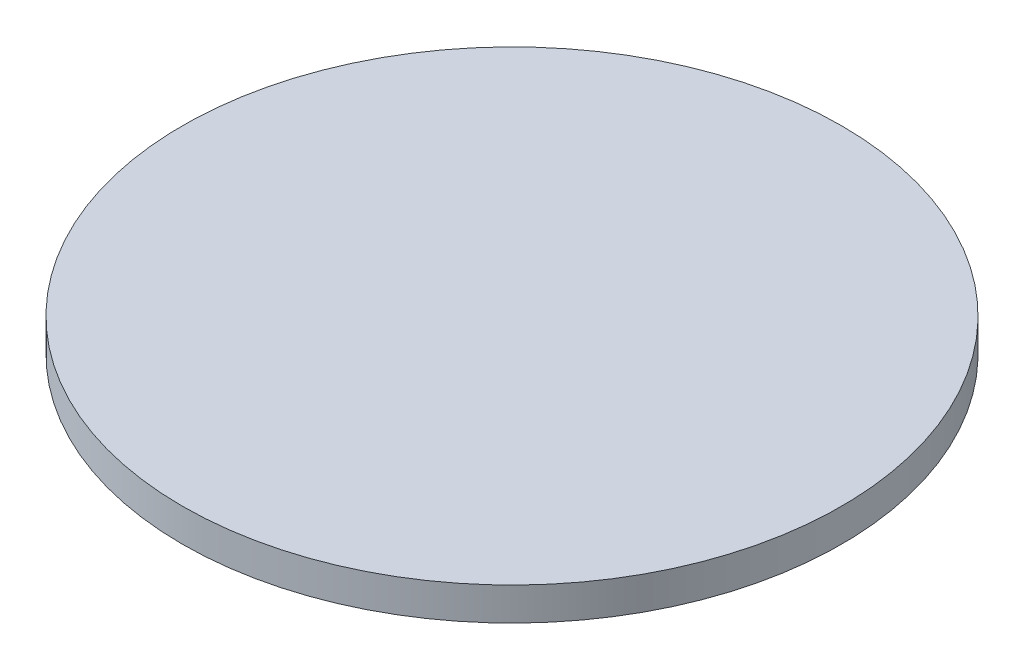
ISO-10303-21;
HEADER;
FILE_DESCRIPTION(('STEP AP214'),'2;1');
FILE_NAME('part.step','',(''),(''),'','','');
FILE_SCHEMA(('AUTOMOTIVE_DESIGN { 1 0 10303 214 1 1 1 1 }'));
ENDSEC;
DATA;
#1=APPLICATION_CONTEXT('core data for automotive mechanical design processes');
#2=APPLICATION_PROTOCOL_DEFINITION('international standard','automotive_design',2000,#1);
#3=PRODUCT_CONTEXT('',#1,'mechanical');
#4=PRODUCT('Part','Part','',(#3));
#5=PRODUCT_RELATED_PRODUCT_CATEGORY('part','',(#4));
#6=PRODUCT_DEFINITION_FORMATION('','',#4);
#7=PRODUCT_DEFINITION_CONTEXT('part definition',#1,'design');
#8=PRODUCT_DEFINITION('design','',#6,#7);
#9=PRODUCT_DEFINITION_SHAPE('','',#8);
#10=(LENGTH_UNIT() NAMED_UNIT(*) SI_UNIT(.MILLI.,.METRE.));
#11=(NAMED_UNIT(*) PLANE_ANGLE_UNIT() SI_UNIT($,.RADIAN.));
#12=(NAMED_UNIT(*) SI_UNIT($,.STERADIAN.) SOLID_ANGLE_UNIT());
#13=UNCERTAINTY_MEASURE_WITH_UNIT(LENGTH_MEASURE(1.E-05),#10,'distance_accuracy_value','');
#14=(GEOMETRIC_REPRESENTATION_CONTEXT(3) GLOBAL_UNCERTAINTY_ASSIGNED_CONTEXT((#13)) GLOBAL_UNIT_ASSIGNED_CONTEXT((#10,
#11,#12)) REPRESENTATION_CONTEXT('',''));
#15=CARTESIAN_POINT('',(0.,0.,0.));
#16=DIRECTION('',(0.,0.,1.));
#17=DIRECTION('',(1.,0.,0.));
#18=AXIS2_PLACEMENT_3D('',#15,#16,#17);
#19=CARTESIAN_POINT('',(0.,115.,0.));
#20=DIRECTION('',(0.,-1.,0.));
#21=DIRECTION('',(0.,0.,-1.));
#22=AXIS2_PLACEMENT_3D('',#19,#20,#21);
#23=CYLINDRICAL_SURFACE('',#22,30.);
#24=CARTESIAN_POINT('',(0.,115.,0.));
#25=DIRECTION('',(0.,1.,0.));
#26=DIRECTION('',(0.,0.,1.));
#27=AXIS2_PLACEMENT_3D('',#24,#25,#26);
#28=CIRCLE('',#27,30.);
#29=CARTESIAN_POINT('',(0.,115.,30.));
#30=VERTEX_POINT('',#29);
#31=EDGE_CURVE('E10',#30,#30,#28,.T.);
#32=ORIENTED_EDGE('',*,*,#31,.F.);
#33=EDGE_LOOP('',(#32));
#34=FACE_BOUND('',#33,.T.);
#35=CARTESIAN_POINT('',(0.,112.,0.));
#36=DIRECTION('',(0.,1.,0.));
#37=DIRECTION('',(0.,0.,1.));
#38=AXIS2_PLACEMENT_3D('',#35,#36,#37);
#39=CIRCLE('',#38,30.);
#40=CARTESIAN_POINT('',(0.,112.,30.));
#41=VERTEX_POINT('',#40);
#42=EDGE_CURVE('E40',#41,#41,#39,.T.);
#43=ORIENTED_EDGE('',*,*,#42,.T.);
#44=EDGE_LOOP('',(#43));
#45=FACE_BOUND('',#44,.T.);
#46=ADVANCED_FACE('F37',(#34,#45),#23,.T.);
#47=CARTESIAN_POINT('',(0.,115.,0.));
#48=DIRECTION('',(0.,1.,0.));
#49=DIRECTION('',(0.,0.,1.));
#50=AXIS2_PLACEMENT_3D('',#47,#48,#49);
#51=PLANE('',#50);
#52=ORIENTED_EDGE('',*,*,#31,.T.);
#53=EDGE_LOOP('',(#52));
#54=FACE_BOUND('',#53,.T.);
#55=ADVANCED_FACE('F52',(#54),#51,.T.);
#56=CARTESIAN_POINT('',(0.,112.,0.));
#57=DIRECTION('',(0.,1.,0.));
#58=DIRECTION('',(0.,0.,1.));
#59=AXIS2_PLACEMENT_3D('',#56,#57,#58);
#60=PLANE('',#59);
#61=ORIENTED_EDGE('',*,*,#42,.F.);
#62=EDGE_LOOP('',(#61));
#63=FACE_BOUND('',#62,.T.);
#64=ADVANCED_FACE('F50',(#63),#60,.F.);
#65=CLOSED_SHELL('',(#46,#55,#64));
#66=MANIFOLD_SOLID_BREP('B2',#65);
#67=ADVANCED_BREP_SHAPE_REPRESENTATION('',(#18,#66),#14);
#68=SHAPE_DEFINITION_REPRESENTATION(#9,#67);
ENDSEC;
END-ISO-10303-21;
